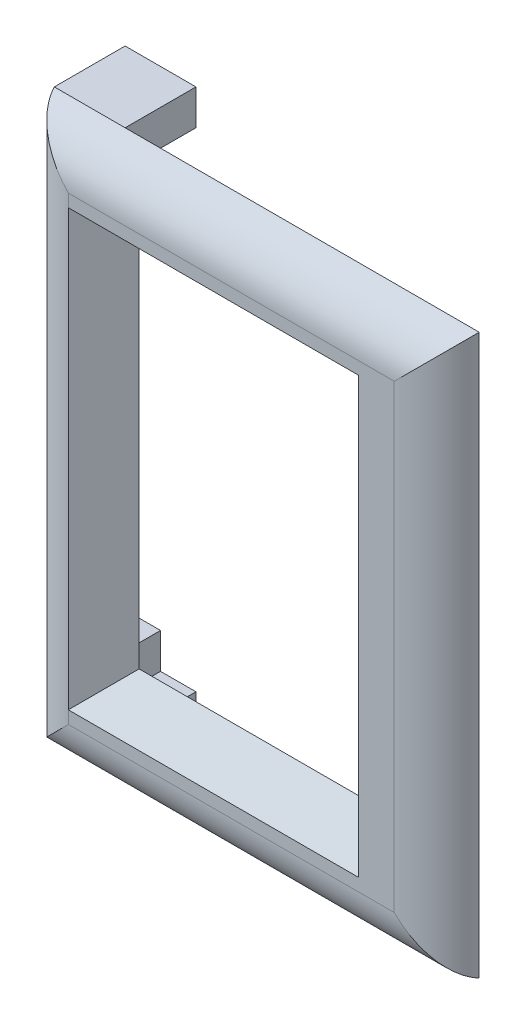
ISO-10303-21;
HEADER;
FILE_DESCRIPTION(('STEP AP214'),'2;1');
FILE_NAME('part.step','',(''),(''),'','','');
FILE_SCHEMA(('AUTOMOTIVE_DESIGN { 1 0 10303 214 1 1 1 1 }'));
ENDSEC;
DATA;
#1=APPLICATION_CONTEXT('core data for automotive mechanical design processes');
#2=APPLICATION_PROTOCOL_DEFINITION('international standard','automotive_design',2000,#1);
#3=PRODUCT_CONTEXT('',#1,'mechanical');
#4=PRODUCT('Part','Part','',(#3));
#5=PRODUCT_RELATED_PRODUCT_CATEGORY('part','',(#4));
#6=PRODUCT_DEFINITION_FORMATION('','',#4);
#7=PRODUCT_DEFINITION_CONTEXT('part definition',#1,'design');
#8=PRODUCT_DEFINITION('design','',#6,#7);
#9=PRODUCT_DEFINITION_SHAPE('','',#8);
#10=(LENGTH_UNIT() NAMED_UNIT(*) SI_UNIT(.MILLI.,.METRE.));
#11=(NAMED_UNIT(*) PLANE_ANGLE_UNIT() SI_UNIT($,.RADIAN.));
#12=(NAMED_UNIT(*) SI_UNIT($,.STERADIAN.) SOLID_ANGLE_UNIT());
#13=UNCERTAINTY_MEASURE_WITH_UNIT(LENGTH_MEASURE(1.E-05),#10,'distance_accuracy_value','');
#14=(GEOMETRIC_REPRESENTATION_CONTEXT(3) GLOBAL_UNCERTAINTY_ASSIGNED_CONTEXT((#13)) GLOBAL_UNIT_ASSIGNED_CONTEXT((#10,
#11,#12)) REPRESENTATION_CONTEXT('',''));
#15=CARTESIAN_POINT('',(0.,0.,0.));
#16=DIRECTION('',(0.,0.,1.));
#17=DIRECTION('',(1.,0.,0.));
#18=AXIS2_PLACEMENT_3D('',#15,#16,#17);
#19=CARTESIAN_POINT('',(0.,0.,2.5));
#20=DIRECTION('',(0.,0.,1.));
#21=DIRECTION('',(1.,0.,0.));
#22=AXIS2_PLACEMENT_3D('',#19,#20,#21);
#23=PLANE('',#22);
#24=DIRECTION('',(1.,0.,0.));
#25=VECTOR('',#24,1.);
#26=CARTESIAN_POINT('',(3.59725964294014E-08,16.2424852932564,2.5));
#27=LINE('',#26,#25);
#28=CARTESIAN_POINT('',(26.5000000359726,16.2424852932564,2.5));
#29=VERTEX_POINT('',#28);
#30=CARTESIAN_POINT('',(3.5000000359726,16.2424852932564,2.5));
#31=VERTEX_POINT('',#30);
#32=EDGE_CURVE('E313',#29,#31,#27,.F.);
#33=ORIENTED_EDGE('',*,*,#32,.T.);
#34=DIRECTION('',(0.,1.,0.));
#35=VECTOR('',#34,1.);
#36=CARTESIAN_POINT('',(3.5000000359726,-19.7427265614296,2.5));
#37=LINE('',#36,#35);
#38=CARTESIAN_POINT('',(3.5000000359726,15.3499974171089,2.5));
#39=VERTEX_POINT('',#38);
#40=EDGE_CURVE('E318',#31,#39,#37,.F.);
#41=ORIENTED_EDGE('',*,*,#40,.T.);
#42=DIRECTION('',(1.,0.,0.));
#43=VECTOR('',#42,1.);
#44=CARTESIAN_POINT('',(20.9876018688099,15.3499974171089,2.5));
#45=LINE('',#44,#43);
#46=CARTESIAN_POINT('',(23.98760186881,15.3499974171089,2.5));
#47=VERTEX_POINT('',#46);
#48=EDGE_CURVE('E292',#39,#47,#45,.T.);
#49=ORIENTED_EDGE('',*,*,#48,.T.);
#50=DIRECTION('',(0.,-1.,0.));
#51=VECTOR('',#50,1.);
#52=CARTESIAN_POINT('',(23.98760186881,-12.35000131526,2.5));
#53=LINE('',#52,#51);
#54=CARTESIAN_POINT('',(23.98760186881,-15.3500013152601,2.5));
#55=VERTEX_POINT('',#54);
#56=EDGE_CURVE('E294',#47,#55,#53,.T.);
#57=ORIENTED_EDGE('',*,*,#56,.T.);
#58=DIRECTION('',(-1.,0.,0.));
#59=VECTOR('',#58,1.);
#60=CARTESIAN_POINT('',(6.4875997094668,-15.3500013152601,2.5));
#61=LINE('',#60,#59);
#62=CARTESIAN_POINT('',(3.5000000359726,-15.3500013152601,2.5));
#63=VERTEX_POINT('',#62);
#64=EDGE_CURVE('E296',#55,#63,#61,.T.);
#65=ORIENTED_EDGE('',*,*,#64,.T.);
#66=DIRECTION('',(0.,1.,0.));
#67=VECTOR('',#66,1.);
#68=CARTESIAN_POINT('',(3.5000000359726,-19.7427265614296,2.5));
#69=LINE('',#68,#67);
#70=CARTESIAN_POINT('',(3.5000000359726,-16.2427265614296,2.5));
#71=VERTEX_POINT('',#70);
#72=EDGE_CURVE('E316',#63,#71,#69,.F.);
#73=ORIENTED_EDGE('',*,*,#72,.T.);
#74=DIRECTION('',(-1.,0.,0.));
#75=VECTOR('',#74,1.);
#76=CARTESIAN_POINT('',(30.0000000359726,-16.2427265614296,2.5));
#77=LINE('',#76,#75);
#78=CARTESIAN_POINT('',(26.5000000359726,-16.2427265614296,2.5));
#79=VERTEX_POINT('',#78);
#80=EDGE_CURVE('E311',#71,#79,#77,.F.);
#81=ORIENTED_EDGE('',*,*,#80,.T.);
#82=DIRECTION('',(0.,-1.,0.));
#83=VECTOR('',#82,1.);
#84=CARTESIAN_POINT('',(26.5000000359726,19.7424852932564,2.5));
#85=LINE('',#84,#83);
#86=EDGE_CURVE('E299',#79,#29,#85,.F.);
#87=ORIENTED_EDGE('',*,*,#86,.T.);
#88=EDGE_LOOP('',(#33,#41,#49,#57,#65,#73,#81,#87));
#89=FACE_BOUND('',#88,.T.);
#90=ADVANCED_FACE('F37',(#89),#23,.T.);
#91=CARTESIAN_POINT('',(0.,0.,0.));
#92=DIRECTION('',(0.,0.,1.));
#93=DIRECTION('',(1.,0.,0.));
#94=AXIS2_PLACEMENT_3D('',#91,#92,#93);
#95=PLANE('',#94);
#96=DIRECTION('',(0.,-1.,0.));
#97=VECTOR('',#96,1.);
#98=CARTESIAN_POINT('',(5.98759970946675,12.3499974171089,0.));
#99=LINE('',#98,#97);
#100=CARTESIAN_POINT('',(5.98759970946675,12.8499974171089,0.));
#101=VERTEX_POINT('',#100);
#102=CARTESIAN_POINT('',(5.98759970946675,-12.8500013152601,0.));
#103=VERTEX_POINT('',#102);
#104=EDGE_CURVE('E283',#101,#103,#99,.T.);
#105=ORIENTED_EDGE('',*,*,#104,.T.);
#106=DIRECTION('',(1.,0.,0.));
#107=VECTOR('',#106,1.);
#108=CARTESIAN_POINT('',(6.4875997094668,-12.8500013152601,0.));
#109=LINE('',#108,#107);
#110=CARTESIAN_POINT('',(21.48760186881,-12.8500013152601,0.));
#111=VERTEX_POINT('',#110);
#112=EDGE_CURVE('E289',#103,#111,#109,.T.);
#113=ORIENTED_EDGE('',*,*,#112,.T.);
#114=DIRECTION('',(0.,1.,0.));
#115=VECTOR('',#114,1.);
#116=CARTESIAN_POINT('',(21.48760186881,12.3499974171089,0.));
#117=LINE('',#116,#115);
#118=CARTESIAN_POINT('',(21.48760186881,12.8499974171089,0.));
#119=VERTEX_POINT('',#118);
#120=EDGE_CURVE('E287',#111,#119,#117,.T.);
#121=ORIENTED_EDGE('',*,*,#120,.T.);
#122=DIRECTION('',(-1.,0.,0.));
#123=VECTOR('',#122,1.);
#124=CARTESIAN_POINT('',(6.4875997094668,12.8499974171089,0.));
#125=LINE('',#124,#123);
#126=EDGE_CURVE('E285',#119,#101,#125,.T.);
#127=ORIENTED_EDGE('',*,*,#126,.T.);
#128=EDGE_LOOP('',(#105,#113,#121,#127));
#129=FACE_BOUND('',#128,.T.);
#130=DIRECTION('',(1.,0.,0.));
#131=VECTOR('',#130,1.);
#132=CARTESIAN_POINT('',(3.59726012642655E-08,-19.7427265614296,0.));
#133=LINE('',#132,#131);
#134=CARTESIAN_POINT('',(5.0000000359726,-19.7427265614296,0.));
#135=VERTEX_POINT('',#134);
#136=CARTESIAN_POINT('',(30.0000000359726,-19.7427265614296,0.));
#137=VERTEX_POINT('',#136);
#138=EDGE_CURVE('E279',#135,#137,#133,.T.);
#139=ORIENTED_EDGE('',*,*,#138,.F.);
#140=DIRECTION('',(0.,1.,0.));
#141=VECTOR('',#140,1.);
#142=CARTESIAN_POINT('',(5.0000000359726,0.,0.));
#143=LINE('',#142,#141);
#144=CARTESIAN_POINT('',(5.0000000359726,-17.2427265614296,0.));
#145=VERTEX_POINT('',#144);
#146=EDGE_CURVE('E214',#135,#145,#143,.T.);
#147=ORIENTED_EDGE('',*,*,#146,.T.);
#148=DIRECTION('',(1.,0.,0.));
#149=VECTOR('',#148,1.);
#150=CARTESIAN_POINT('',(0.,-17.2427265614296,0.));
#151=LINE('',#150,#149);
#152=CARTESIAN_POINT('',(2.5,-17.2427265614296,0.));
#153=VERTEX_POINT('',#152);
#154=EDGE_CURVE('E212',#153,#145,#151,.T.);
#155=ORIENTED_EDGE('',*,*,#154,.F.);
#156=DIRECTION('',(0.,1.,0.));
#157=VECTOR('',#156,1.);
#158=CARTESIAN_POINT('',(2.5,0.,0.));
#159=LINE('',#158,#157);
#160=CARTESIAN_POINT('',(2.5,-14.7427265614296,0.));
#161=VERTEX_POINT('',#160);
#162=EDGE_CURVE('E180',#153,#161,#159,.T.);
#163=ORIENTED_EDGE('',*,*,#162,.T.);
#164=DIRECTION('',(1.,0.,0.));
#165=VECTOR('',#164,1.);
#166=CARTESIAN_POINT('',(0.,-14.7427265614296,0.));
#167=LINE('',#166,#165);
#168=CARTESIAN_POINT('',(3.59726006520281E-08,-14.7427265614296,0.));
#169=VERTEX_POINT('',#168);
#170=EDGE_CURVE('E198',#169,#161,#167,.T.);
#171=ORIENTED_EDGE('',*,*,#170,.F.);
#172=DIRECTION('',(0.,-1.,0.));
#173=VECTOR('',#172,1.);
#174=CARTESIAN_POINT('',(3.59725964294014E-08,19.7424852932564,0.));
#175=LINE('',#174,#173);
#176=CARTESIAN_POINT('',(3.59725970416099E-08,14.7427205891547,0.));
#177=VERTEX_POINT('',#176);
#178=EDGE_CURVE('E275',#177,#169,#175,.T.);
#179=ORIENTED_EDGE('',*,*,#178,.F.);
#180=DIRECTION('',(0.999999999999985,1.74845464495643E-07,0.));
#181=VECTOR('',#180,1.);
#182=CARTESIAN_POINT('',(-2.57769777201977E-06,14.7427202613195,0.));
#183=LINE('',#182,#181);
#184=CARTESIAN_POINT('',(2.49999742230164,14.7427206984331,0.));
#185=VERTEX_POINT('',#184);
#186=EDGE_CURVE('E54',#177,#185,#183,.T.);
#187=ORIENTED_EDGE('',*,*,#186,.T.);
#188=DIRECTION('',(1.70528752230226E-07,-0.999999999999986,0.));
#189=VECTOR('',#188,1.);
#190=CARTESIAN_POINT('',(2.49999993635933,4.26321869723007E-07,0.));
#191=LINE('',#190,#189);
#192=CARTESIAN_POINT('',(2.49999699597976,17.2427206984331,0.));
#193=VERTEX_POINT('',#192);
#194=EDGE_CURVE('E59',#193,#185,#191,.T.);
#195=ORIENTED_EDGE('',*,*,#194,.F.);
#196=DIRECTION('',(0.999999999999985,1.74845464122321E-07,0.));
#197=VECTOR('',#196,1.);
#198=CARTESIAN_POINT('',(-3.01481142682179E-06,17.2427202613194,0.));
#199=LINE('',#198,#197);
#200=CARTESIAN_POINT('',(4.99999702116054,17.2427211355468,0.));
#201=VERTEX_POINT('',#200);
#202=EDGE_CURVE('E249',#193,#201,#199,.T.);
#203=ORIENTED_EDGE('',*,*,#202,.T.);
#204=DIRECTION('',(1.74845464842588E-07,-0.999999999999985,0.));
#205=VECTOR('',#204,1.);
#206=CARTESIAN_POINT('',(5.00000003597198,8.74227330502489E-07,0.));
#207=LINE('',#206,#205);
#208=CARTESIAN_POINT('',(4.99999691188212,19.7424852932564,0.));
#209=VERTEX_POINT('',#208);
#210=EDGE_CURVE('E246',#209,#201,#207,.T.);
#211=ORIENTED_EDGE('',*,*,#210,.F.);
#212=DIRECTION('',(-1.,0.,0.));
#213=VECTOR('',#212,1.);
#214=CARTESIAN_POINT('',(3.59725964294014E-08,19.7424852932564,0.));
#215=LINE('',#214,#213);
#216=CARTESIAN_POINT('',(30.0000000359726,19.7424852932564,0.));
#217=VERTEX_POINT('',#216);
#218=EDGE_CURVE('E271',#217,#209,#215,.T.);
#219=ORIENTED_EDGE('',*,*,#218,.F.);
#220=DIRECTION('',(0.,1.,0.));
#221=VECTOR('',#220,1.);
#222=CARTESIAN_POINT('',(30.0000000359726,19.7424852932564,0.));
#223=LINE('',#222,#221);
#224=EDGE_CURVE('E268',#137,#217,#223,.T.);
#225=ORIENTED_EDGE('',*,*,#224,.F.);
#226=EDGE_LOOP('',(#139,#147,#155,#163,#171,#179,#187,#195,#203,#211,#219,#225));
#227=FACE_BOUND('',#226,.T.);
#228=ADVANCED_FACE('F343',(#129,#227),#95,.F.);
#229=CARTESIAN_POINT('',(6.4875997094668,12.3499974171089,-0.500000000000053));
#230=DIRECTION('',(0.,-0.707106781186551,0.707106781186544));
#231=DIRECTION('',(1.,0.,0.));
#232=AXIS2_PLACEMENT_3D('',#229,#230,#231);
#233=PLANE('',#232);
#234=ORIENTED_EDGE('',*,*,#48,.F.);
#235=CARTESIAN_POINT('',(3.5000000359726,11.649997417109,-1.2));
#236=DIRECTION('',(0.,-0.707106781186551,0.707106781186544));
#237=DIRECTION('',(0.,-0.707106781186544,-0.707106781186551));
#238=AXIS2_PLACEMENT_3D('',#235,#236,#237);
#239=ELLIPSE('',#238,5.23259018078043,3.7);
#240=CARTESIAN_POINT('',(3.48762041964641,15.3499767069293,2.49997928982037));
#241=VERTEX_POINT('',#240);
#242=EDGE_CURVE('E320',#39,#241,#239,.T.);
#243=ORIENTED_EDGE('',*,*,#242,.T.);
#244=DIRECTION('',(0.577350269189624,-0.577350269189624,-0.57735026918963));
#245=VECTOR('',#244,1.);
#246=CARTESIAN_POINT('',(6.4875997094668,12.3499974171089,-0.500000000000053));
#247=LINE('',#246,#245);
#248=EDGE_CURVE('E272',#101,#241,#247,.F.);
#249=ORIENTED_EDGE('',*,*,#248,.F.);
#250=ORIENTED_EDGE('',*,*,#126,.F.);
#251=DIRECTION('',(-0.577350269189624,-0.577350269189624,-0.57735026918963));
#252=VECTOR('',#251,1.);
#253=CARTESIAN_POINT('',(16.1542678156956,7.51666336399455,-5.33333405311445));
#254=LINE('',#253,#252);
#255=EDGE_CURVE('E305',#47,#119,#254,.T.);
#256=ORIENTED_EDGE('',*,*,#255,.F.);
#257=EDGE_LOOP('',(#234,#243,#249,#250,#256));
#258=FACE_BOUND('',#257,.T.);
#259=ADVANCED_FACE('F385',(#258),#233,.T.);
#260=CARTESIAN_POINT('',(6.4875997094668,12.3499974171089,-0.500000000000053));
#261=DIRECTION('',(0.707106781186551,0.,0.707106781186544));
#262=DIRECTION('',(0.,1.,0.));
#263=AXIS2_PLACEMENT_3D('',#260,#261,#262);
#264=PLANE('',#263);
#265=ORIENTED_EDGE('',*,*,#248,.T.);
#266=DIRECTION('',(0.,-1.,0.));
#267=VECTOR('',#266,1.);
#268=CARTESIAN_POINT('',(3.48762041964641,15.3499767069293,2.49997928982037));
#269=LINE('',#268,#267);
#270=CARTESIAN_POINT('',(3.48762041964642,-15.3499806050804,2.49997928982036));
#271=VERTEX_POINT('',#270);
#272=EDGE_CURVE('E46',#241,#271,#269,.T.);
#273=ORIENTED_EDGE('',*,*,#272,.T.);
#274=DIRECTION('',(-0.577350269189624,-0.577350269189624,0.57735026918963));
#275=VECTOR('',#274,1.);
#276=CARTESIAN_POINT('',(14.7209326202564,-4.11666840447045,-8.73333291078973));
#277=LINE('',#276,#275);
#278=EDGE_CURVE('E302',#103,#271,#277,.T.);
#279=ORIENTED_EDGE('',*,*,#278,.F.);
#280=ORIENTED_EDGE('',*,*,#104,.F.);
#281=EDGE_LOOP('',(#265,#273,#279,#280));
#282=FACE_BOUND('',#281,.T.);
#283=ADVANCED_FACE('F381',(#282),#264,.T.);
#284=CARTESIAN_POINT('',(20.9876018688099,12.3499974171089,-0.500000000000053));
#285=DIRECTION('',(-0.707106781186551,0.,0.707106781186544));
#286=DIRECTION('',(0.,-1.,0.));
#287=AXIS2_PLACEMENT_3D('',#284,#285,#286);
#288=PLANE('',#287);
#289=ORIENTED_EDGE('',*,*,#255,.T.);
#290=ORIENTED_EDGE('',*,*,#120,.F.);
#291=DIRECTION('',(-0.577350269189624,0.577350269189624,-0.57735026918963));
#292=VECTOR('',#291,1.);
#293=CARTESIAN_POINT('',(12.7542689580204,-4.11666840447045,-8.73333291078973));
#294=LINE('',#293,#292);
#295=EDGE_CURVE('E300',#55,#111,#294,.T.);
#296=ORIENTED_EDGE('',*,*,#295,.F.);
#297=ORIENTED_EDGE('',*,*,#56,.F.);
#298=EDGE_LOOP('',(#289,#290,#296,#297));
#299=FACE_BOUND('',#298,.T.);
#300=ADVANCED_FACE('F389',(#299),#288,.T.);
#301=CARTESIAN_POINT('',(6.4875997094668,-12.35000131526,-0.500000000000053));
#302=DIRECTION('',(0.,0.707106781186551,0.707106781186544));
#303=DIRECTION('',(-1.,0.,0.));
#304=AXIS2_PLACEMENT_3D('',#301,#302,#303);
#305=PLANE('',#304);
#306=ORIENTED_EDGE('',*,*,#278,.T.);
#307=CARTESIAN_POINT('',(3.5000000359726,-11.6500013152601,-1.2));
#308=DIRECTION('',(0.,0.707106781186551,0.707106781186544));
#309=DIRECTION('',(0.,-0.707106781186544,0.707106781186551));
#310=AXIS2_PLACEMENT_3D('',#307,#308,#309);
#311=ELLIPSE('',#310,5.23259018078043,3.7);
#312=EDGE_CURVE('E11',#271,#63,#311,.T.);
#313=ORIENTED_EDGE('',*,*,#312,.T.);
#314=ORIENTED_EDGE('',*,*,#64,.F.);
#315=ORIENTED_EDGE('',*,*,#295,.T.);
#316=ORIENTED_EDGE('',*,*,#112,.F.);
#317=EDGE_LOOP('',(#306,#313,#314,#315,#316));
#318=FACE_BOUND('',#317,.T.);
#319=ADVANCED_FACE('F375',(#318),#305,.T.);
#320=CARTESIAN_POINT('',(3.59726012642655E-08,-16.2427265614296,-1.2));
#321=DIRECTION('',(1.,0.,0.));
#322=DIRECTION('',(0.,0.,-1.));
#323=AXIS2_PLACEMENT_3D('',#320,#321,#322);
#324=CYLINDRICAL_SURFACE('',#323,3.7);
#325=CARTESIAN_POINT('',(3.5000000359726,-16.2427265614296,-1.2));
#326=DIRECTION('',(0.707106781186548,-0.707106781186547,0.));
#327=DIRECTION('',(-0.707106781186547,-0.707106781186548,0.));
#328=AXIS2_PLACEMENT_3D('',#325,#326,#327);
#329=ELLIPSE('',#328,5.23259018078045,3.7);
#330=CARTESIAN_POINT('',(3.59726012642655E-08,-19.7427265614296,0.));
#331=VERTEX_POINT('',#330);
#332=EDGE_CURVE('E325',#331,#71,#329,.F.);
#333=ORIENTED_EDGE('',*,*,#332,.F.);
#334=EDGE_CURVE('E280',#331,#135,#133,.T.);
#335=ORIENTED_EDGE('',*,*,#334,.T.);
#336=ORIENTED_EDGE('',*,*,#138,.T.);
#337=CARTESIAN_POINT('',(26.5000000359726,-16.2427265614296,-1.2));
#338=DIRECTION('',(0.707106781186547,0.707106781186547,0.));
#339=DIRECTION('',(-0.707106781186547,0.707106781186547,0.));
#340=AXIS2_PLACEMENT_3D('',#337,#338,#339);
#341=ELLIPSE('',#340,5.23259018078045,3.7);
#342=EDGE_CURVE('E41',#79,#137,#341,.T.);
#343=ORIENTED_EDGE('',*,*,#342,.F.);
#344=ORIENTED_EDGE('',*,*,#80,.F.);
#345=EDGE_LOOP('',(#333,#335,#336,#343,#344));
#346=FACE_BOUND('',#345,.T.);
#347=ADVANCED_FACE('F39',(#346),#324,.T.);
#348=CARTESIAN_POINT('',(26.5000000359726,19.7424852932564,-1.2));
#349=DIRECTION('',(0.,1.,0.));
#350=DIRECTION('',(0.,0.,1.));
#351=AXIS2_PLACEMENT_3D('',#348,#349,#350);
#352=CYLINDRICAL_SURFACE('',#351,3.7);
#353=ORIENTED_EDGE('',*,*,#342,.T.);
#354=ORIENTED_EDGE('',*,*,#224,.T.);
#355=CARTESIAN_POINT('',(26.5000000359726,16.2424852932564,-1.2));
#356=DIRECTION('',(-0.707106781186547,0.707106781186547,0.));
#357=DIRECTION('',(0.707106781186547,0.707106781186547,0.));
#358=AXIS2_PLACEMENT_3D('',#355,#356,#357);
#359=ELLIPSE('',#358,5.23259018078045,3.7);
#360=EDGE_CURVE('E324',#29,#217,#359,.T.);
#361=ORIENTED_EDGE('',*,*,#360,.F.);
#362=ORIENTED_EDGE('',*,*,#86,.F.);
#363=EDGE_LOOP('',(#353,#354,#361,#362));
#364=FACE_BOUND('',#363,.T.);
#365=ADVANCED_FACE('F335',(#364),#352,.T.);
#366=CARTESIAN_POINT('',(3.5000000359726,19.7424852932564,-1.2));
#367=DIRECTION('',(0.,-1.,0.));
#368=DIRECTION('',(1.,0.,0.));
#369=AXIS2_PLACEMENT_3D('',#366,#367,#368);
#370=CYLINDRICAL_SURFACE('',#369,3.7);
#371=ORIENTED_EDGE('',*,*,#242,.F.);
#372=ORIENTED_EDGE('',*,*,#40,.F.);
#373=CARTESIAN_POINT('',(3.5000000359726,16.2424852932564,-1.2));
#374=DIRECTION('',(-0.707106781186547,-0.707106781186548,0.));
#375=DIRECTION('',(0.707106781186548,-0.707106781186547,0.));
#376=AXIS2_PLACEMENT_3D('',#373,#374,#375);
#377=ELLIPSE('',#376,5.23259018078045,3.7);
#378=CARTESIAN_POINT('',(3.59725964294014E-08,19.7424852932564,0.));
#379=VERTEX_POINT('',#378);
#380=EDGE_CURVE('E267',#379,#31,#377,.F.);
#381=ORIENTED_EDGE('',*,*,#380,.F.);
#382=EDGE_CURVE('E276',#379,#177,#175,.T.);
#383=ORIENTED_EDGE('',*,*,#382,.T.);
#384=ORIENTED_EDGE('',*,*,#178,.T.);
#385=DIRECTION('',(0.,1.,0.));
#386=VECTOR('',#385,1.);
#387=CARTESIAN_POINT('',(3.59725988468187E-08,0.,0.));
#388=LINE('',#387,#386);
#389=EDGE_CURVE('E201',#331,#169,#388,.T.);
#390=ORIENTED_EDGE('',*,*,#389,.F.);
#391=ORIENTED_EDGE('',*,*,#332,.T.);
#392=ORIENTED_EDGE('',*,*,#72,.F.);
#393=ORIENTED_EDGE('',*,*,#312,.F.);
#394=ORIENTED_EDGE('',*,*,#272,.F.);
#395=EDGE_LOOP('',(#371,#372,#381,#383,#384,#390,#391,#392,#393,#394));
#396=FACE_BOUND('',#395,.T.);
#397=ADVANCED_FACE('F367',(#396),#370,.T.);
#398=CARTESIAN_POINT('',(3.59725964294014E-08,16.2424852932564,-1.2));
#399=DIRECTION('',(-1.,0.,0.));
#400=DIRECTION('',(0.,0.,1.));
#401=AXIS2_PLACEMENT_3D('',#398,#399,#400);
#402=CYLINDRICAL_SURFACE('',#401,3.7);
#403=ORIENTED_EDGE('',*,*,#360,.T.);
#404=ORIENTED_EDGE('',*,*,#218,.T.);
#405=DIRECTION('',(1.,0.,0.));
#406=VECTOR('',#405,1.);
#407=CARTESIAN_POINT('',(0.,19.7424852932564,0.));
#408=LINE('',#407,#406);
#409=EDGE_CURVE('E243',#379,#209,#408,.T.);
#410=ORIENTED_EDGE('',*,*,#409,.F.);
#411=ORIENTED_EDGE('',*,*,#380,.T.);
#412=ORIENTED_EDGE('',*,*,#32,.F.);
#413=EDGE_LOOP('',(#403,#404,#410,#411,#412));
#414=FACE_BOUND('',#413,.T.);
#415=ADVANCED_FACE('F345',(#414),#402,.T.);
#416=CARTESIAN_POINT('',(-2.57769777201977E-06,14.7427202613195,-5.));
#417=DIRECTION('',(1.74845464495643E-07,-0.999999999999985,0.));
#418=DIRECTION('',(0.999999999999985,1.74845464495643E-07,0.));
#419=AXIS2_PLACEMENT_3D('',#416,#417,#418);
#420=PLANE('',#419);
#421=ORIENTED_EDGE('',*,*,#186,.F.);
#422=DIRECTION('',(0.,0.,1.));
#423=VECTOR('',#422,1.);
#424=CARTESIAN_POINT('',(3.59725970416099E-08,14.7427204798763,-5.));
#425=LINE('',#424,#423);
#426=CARTESIAN_POINT('',(3.59725970416099E-08,14.7427204798763,-5.));
#427=VERTEX_POINT('',#426);
#428=EDGE_CURVE('E264',#427,#177,#425,.T.);
#429=ORIENTED_EDGE('',*,*,#428,.F.);
#430=DIRECTION('',(0.999999999999985,1.74845464495643E-07,0.));
#431=VECTOR('',#430,1.);
#432=CARTESIAN_POINT('',(-2.57769777201977E-06,14.7427202613195,-5.));
#433=LINE('',#432,#431);
#434=CARTESIAN_POINT('',(2.49999742230164,14.7427206984331,-5.));
#435=VERTEX_POINT('',#434);
#436=EDGE_CURVE('E227',#427,#435,#433,.T.);
#437=ORIENTED_EDGE('',*,*,#436,.T.);
#438=DIRECTION('',(0.,0.,1.));
#439=VECTOR('',#438,1.);
#440=CARTESIAN_POINT('',(2.49999742230164,14.7427206984331,-5.));
#441=LINE('',#440,#439);
#442=EDGE_CURVE('E241',#435,#185,#441,.T.);
#443=ORIENTED_EDGE('',*,*,#442,.T.);
#444=EDGE_LOOP('',(#421,#429,#437,#443));
#445=FACE_BOUND('',#444,.T.);
#446=ADVANCED_FACE('F422',(#445),#420,.T.);
#447=CARTESIAN_POINT('',(3.59725988468187E-08,0.,-5.));
#448=DIRECTION('',(1.,0.,0.));
#449=DIRECTION('',(0.,1.,0.));
#450=AXIS2_PLACEMENT_3D('',#447,#448,#449);
#451=PLANE('',#450);
#452=ORIENTED_EDGE('',*,*,#382,.F.);
#453=DIRECTION('',(0.,0.,1.));
#454=VECTOR('',#453,1.);
#455=CARTESIAN_POINT('',(3.59725964294011E-08,19.7424852932564,-5.));
#456=LINE('',#455,#454);
#457=CARTESIAN_POINT('',(3.59725964294011E-08,19.7424852932564,-5.));
#458=VERTEX_POINT('',#457);
#459=EDGE_CURVE('E261',#458,#379,#456,.T.);
#460=ORIENTED_EDGE('',*,*,#459,.F.);
#461=DIRECTION('',(0.,1.,0.));
#462=VECTOR('',#461,1.);
#463=CARTESIAN_POINT('',(3.59725988468187E-08,0.,-5.));
#464=LINE('',#463,#462);
#465=EDGE_CURVE('E230',#427,#458,#464,.T.);
#466=ORIENTED_EDGE('',*,*,#465,.F.);
#467=ORIENTED_EDGE('',*,*,#428,.T.);
#468=EDGE_LOOP('',(#452,#460,#466,#467));
#469=FACE_BOUND('',#468,.T.);
#470=ADVANCED_FACE('F364',(#469),#451,.F.);
#471=CARTESIAN_POINT('',(0.,19.7424852932564,-5.));
#472=DIRECTION('',(0.,-1.,0.));
#473=DIRECTION('',(0.,0.,-1.));
#474=AXIS2_PLACEMENT_3D('',#471,#472,#473);
#475=PLANE('',#474);
#476=ORIENTED_EDGE('',*,*,#409,.T.);
#477=DIRECTION('',(0.,0.,1.));
#478=VECTOR('',#477,1.);
#479=CARTESIAN_POINT('',(4.99999680260371,19.7424852932564,-5.));
#480=LINE('',#479,#478);
#481=CARTESIAN_POINT('',(4.99999680260371,19.7424852932564,-5.));
#482=VERTEX_POINT('',#481);
#483=EDGE_CURVE('E258',#482,#209,#480,.T.);
#484=ORIENTED_EDGE('',*,*,#483,.F.);
#485=DIRECTION('',(1.,0.,0.));
#486=VECTOR('',#485,1.);
#487=CARTESIAN_POINT('',(0.,19.7424852932564,-5.));
#488=LINE('',#487,#486);
#489=EDGE_CURVE('E232',#458,#482,#488,.T.);
#490=ORIENTED_EDGE('',*,*,#489,.F.);
#491=ORIENTED_EDGE('',*,*,#459,.T.);
#492=EDGE_LOOP('',(#476,#484,#490,#491));
#493=FACE_BOUND('',#492,.T.);
#494=ADVANCED_FACE('F350',(#493),#475,.F.);
#495=CARTESIAN_POINT('',(5.00000003597198,8.74227330502489E-07,-5.));
#496=DIRECTION('',(-0.999999999999985,-1.74845464842588E-07,0.));
#497=DIRECTION('',(1.74845464842588E-07,-0.999999999999985,0.));
#498=AXIS2_PLACEMENT_3D('',#495,#496,#497);
#499=PLANE('',#498);
#500=ORIENTED_EDGE('',*,*,#210,.T.);
#501=DIRECTION('',(0.,0.,1.));
#502=VECTOR('',#501,1.);
#503=CARTESIAN_POINT('',(4.99999702116054,17.2427211355468,-5.));
#504=LINE('',#503,#502);
#505=CARTESIAN_POINT('',(4.99999702116054,17.2427211355468,-5.));
#506=VERTEX_POINT('',#505);
#507=EDGE_CURVE('E255',#506,#201,#504,.T.);
#508=ORIENTED_EDGE('',*,*,#507,.F.);
#509=DIRECTION('',(1.74845464842588E-07,-0.999999999999985,0.));
#510=VECTOR('',#509,1.);
#511=CARTESIAN_POINT('',(5.00000003597198,8.74227330502489E-07,-5.));
#512=LINE('',#511,#510);
#513=EDGE_CURVE('E234',#482,#506,#512,.T.);
#514=ORIENTED_EDGE('',*,*,#513,.F.);
#515=ORIENTED_EDGE('',*,*,#483,.T.);
#516=EDGE_LOOP('',(#500,#508,#514,#515));
#517=FACE_BOUND('',#516,.T.);
#518=ADVANCED_FACE('F355',(#517),#499,.F.);
#519=CARTESIAN_POINT('',(-3.01481142682179E-06,17.2427202613194,-5.));
#520=DIRECTION('',(1.74845464122321E-07,-0.999999999999985,0.));
#521=DIRECTION('',(0.999999999999985,1.74845464122321E-07,0.));
#522=AXIS2_PLACEMENT_3D('',#519,#520,#521);
#523=PLANE('',#522);
#524=ORIENTED_EDGE('',*,*,#202,.F.);
#525=DIRECTION('',(0.,0.,1.));
#526=VECTOR('',#525,1.);
#527=CARTESIAN_POINT('',(2.49999699597976,17.2427206984331,-5.));
#528=LINE('',#527,#526);
#529=CARTESIAN_POINT('',(2.49999699597976,17.2427206984331,-5.));
#530=VERTEX_POINT('',#529);
#531=EDGE_CURVE('E253',#530,#193,#528,.T.);
#532=ORIENTED_EDGE('',*,*,#531,.F.);
#533=DIRECTION('',(0.999999999999985,1.74845464122321E-07,0.));
#534=VECTOR('',#533,1.);
#535=CARTESIAN_POINT('',(-3.01481142682179E-06,17.2427202613194,-5.));
#536=LINE('',#535,#534);
#537=EDGE_CURVE('E236',#530,#506,#536,.T.);
#538=ORIENTED_EDGE('',*,*,#537,.T.);
#539=ORIENTED_EDGE('',*,*,#507,.T.);
#540=EDGE_LOOP('',(#524,#532,#538,#539));
#541=FACE_BOUND('',#540,.T.);
#542=ADVANCED_FACE('F506',(#541),#523,.T.);
#543=CARTESIAN_POINT('',(2.49999993635933,4.26321869723007E-07,-5.));
#544=DIRECTION('',(-0.999999999999985,-1.70528752230226E-07,0.));
#545=DIRECTION('',(1.70528752230226E-07,-0.999999999999985,0.));
#546=AXIS2_PLACEMENT_3D('',#543,#544,#545);
#547=PLANE('',#546);
#548=ORIENTED_EDGE('',*,*,#194,.T.);
#549=ORIENTED_EDGE('',*,*,#442,.F.);
#550=DIRECTION('',(1.70528752230226E-07,-0.999999999999986,0.));
#551=VECTOR('',#550,1.);
#552=CARTESIAN_POINT('',(2.49999993635933,4.26321869723007E-07,-5.));
#553=LINE('',#552,#551);
#554=EDGE_CURVE('E239',#530,#435,#553,.T.);
#555=ORIENTED_EDGE('',*,*,#554,.F.);
#556=ORIENTED_EDGE('',*,*,#531,.T.);
#557=EDGE_LOOP('',(#548,#549,#555,#556));
#558=FACE_BOUND('',#557,.T.);
#559=ADVANCED_FACE('F514',(#558),#547,.F.);
#560=CARTESIAN_POINT('',(0.,0.,-5.));
#561=DIRECTION('',(0.,0.,-1.));
#562=DIRECTION('',(-1.,0.,0.));
#563=AXIS2_PLACEMENT_3D('',#560,#561,#562);
#564=PLANE('',#563);
#565=ORIENTED_EDGE('',*,*,#436,.F.);
#566=ORIENTED_EDGE('',*,*,#465,.T.);
#567=ORIENTED_EDGE('',*,*,#489,.T.);
#568=ORIENTED_EDGE('',*,*,#513,.T.);
#569=ORIENTED_EDGE('',*,*,#537,.F.);
#570=ORIENTED_EDGE('',*,*,#554,.T.);
#571=EDGE_LOOP('',(#565,#566,#567,#568,#569,#570));
#572=FACE_BOUND('',#571,.T.);
#573=ADVANCED_FACE('F360',(#572),#564,.T.);
#574=CARTESIAN_POINT('',(2.5,0.,-5.));
#575=DIRECTION('',(1.,0.,0.));
#576=DIRECTION('',(0.,0.,-1.));
#577=AXIS2_PLACEMENT_3D('',#574,#575,#576);
#578=PLANE('',#577);
#579=ORIENTED_EDGE('',*,*,#162,.F.);
#580=DIRECTION('',(0.,0.,1.));
#581=VECTOR('',#580,1.);
#582=CARTESIAN_POINT('',(2.5,-17.2427265614296,-5.));
#583=LINE('',#582,#581);
#584=CARTESIAN_POINT('',(2.5,-17.2427265614296,-5.));
#585=VERTEX_POINT('',#584);
#586=EDGE_CURVE('E174',#585,#153,#583,.T.);
#587=ORIENTED_EDGE('',*,*,#586,.F.);
#588=DIRECTION('',(0.,1.,0.));
#589=VECTOR('',#588,1.);
#590=CARTESIAN_POINT('',(2.5,0.,-5.));
#591=LINE('',#590,#589);
#592=CARTESIAN_POINT('',(2.5,-14.7427265614296,-5.));
#593=VERTEX_POINT('',#592);
#594=EDGE_CURVE('E178',#585,#593,#591,.T.);
#595=ORIENTED_EDGE('',*,*,#594,.T.);
#596=DIRECTION('',(0.,0.,1.));
#597=VECTOR('',#596,1.);
#598=CARTESIAN_POINT('',(2.5,-14.7427265614296,-5.));
#599=LINE('',#598,#597);
#600=EDGE_CURVE('E210',#593,#161,#599,.T.);
#601=ORIENTED_EDGE('',*,*,#600,.T.);
#602=EDGE_LOOP('',(#579,#587,#595,#601));
#603=FACE_BOUND('',#602,.T.);
#604=ADVANCED_FACE('F176',(#603),#578,.T.);
#605=CARTESIAN_POINT('',(0.,-17.2427265614296,-5.));
#606=DIRECTION('',(0.,-1.,0.));
#607=DIRECTION('',(0.,0.,-1.));
#608=AXIS2_PLACEMENT_3D('',#605,#606,#607);
#609=PLANE('',#608);
#610=ORIENTED_EDGE('',*,*,#154,.T.);
#611=DIRECTION('',(0.,0.,1.));
#612=VECTOR('',#611,1.);
#613=CARTESIAN_POINT('',(5.0000000359726,-17.2427265614296,-5.));
#614=LINE('',#613,#612);
#615=CARTESIAN_POINT('',(5.0000000359726,-17.2427265614296,-5.));
#616=VERTEX_POINT('',#615);
#617=EDGE_CURVE('E184',#616,#145,#614,.T.);
#618=ORIENTED_EDGE('',*,*,#617,.F.);
#619=DIRECTION('',(1.,0.,0.));
#620=VECTOR('',#619,1.);
#621=CARTESIAN_POINT('',(0.,-17.2427265614296,-5.));
#622=LINE('',#621,#620);
#623=EDGE_CURVE('E187',#585,#616,#622,.T.);
#624=ORIENTED_EDGE('',*,*,#623,.F.);
#625=ORIENTED_EDGE('',*,*,#586,.T.);
#626=EDGE_LOOP('',(#610,#618,#624,#625));
#627=FACE_BOUND('',#626,.T.);
#628=ADVANCED_FACE('F188',(#627),#609,.F.);
#629=CARTESIAN_POINT('',(5.0000000359726,0.,-5.));
#630=DIRECTION('',(1.,0.,0.));
#631=DIRECTION('',(0.,0.,-1.));
#632=AXIS2_PLACEMENT_3D('',#629,#630,#631);
#633=PLANE('',#632);
#634=ORIENTED_EDGE('',*,*,#146,.F.);
#635=DIRECTION('',(0.,0.,1.));
#636=VECTOR('',#635,1.);
#637=CARTESIAN_POINT('',(5.0000000359726,-19.7427265614296,-5.));
#638=LINE('',#637,#636);
#639=CARTESIAN_POINT('',(5.0000000359726,-19.7427265614296,-5.));
#640=VERTEX_POINT('',#639);
#641=EDGE_CURVE('E224',#640,#135,#638,.T.);
#642=ORIENTED_EDGE('',*,*,#641,.F.);
#643=DIRECTION('',(0.,1.,0.));
#644=VECTOR('',#643,1.);
#645=CARTESIAN_POINT('',(5.0000000359726,0.,-5.));
#646=LINE('',#645,#644);
#647=EDGE_CURVE('E192',#640,#616,#646,.T.);
#648=ORIENTED_EDGE('',*,*,#647,.T.);
#649=ORIENTED_EDGE('',*,*,#617,.T.);
#650=EDGE_LOOP('',(#634,#642,#648,#649));
#651=FACE_BOUND('',#650,.T.);
#652=ADVANCED_FACE('F545',(#651),#633,.T.);
#653=CARTESIAN_POINT('',(0.,-19.7427265614296,-5.));
#654=DIRECTION('',(0.,1.,0.));
#655=DIRECTION('',(0.,0.,1.));
#656=AXIS2_PLACEMENT_3D('',#653,#654,#655);
#657=PLANE('',#656);
#658=ORIENTED_EDGE('',*,*,#334,.F.);
#659=DIRECTION('',(0.,0.,1.));
#660=VECTOR('',#659,1.);
#661=CARTESIAN_POINT('',(3.59726012642655E-08,-19.7427265614296,-5.));
#662=LINE('',#661,#660);
#663=CARTESIAN_POINT('',(3.59726012642655E-08,-19.7427265614296,-5.));
#664=VERTEX_POINT('',#663);
#665=EDGE_CURVE('E222',#664,#331,#662,.T.);
#666=ORIENTED_EDGE('',*,*,#665,.F.);
#667=DIRECTION('',(-1.,0.,0.));
#668=VECTOR('',#667,1.);
#669=CARTESIAN_POINT('',(0.,-19.7427265614296,-5.));
#670=LINE('',#669,#668);
#671=EDGE_CURVE('E205',#640,#664,#670,.T.);
#672=ORIENTED_EDGE('',*,*,#671,.F.);
#673=ORIENTED_EDGE('',*,*,#641,.T.);
#674=EDGE_LOOP('',(#658,#666,#672,#673));
#675=FACE_BOUND('',#674,.T.);
#676=ADVANCED_FACE('F553',(#675),#657,.F.);
#677=CARTESIAN_POINT('',(3.59725988468187E-08,0.,-5.));
#678=DIRECTION('',(1.,0.,0.));
#679=DIRECTION('',(0.,1.,0.));
#680=AXIS2_PLACEMENT_3D('',#677,#678,#679);
#681=PLANE('',#680);
#682=ORIENTED_EDGE('',*,*,#389,.T.);
#683=DIRECTION('',(0.,0.,1.));
#684=VECTOR('',#683,1.);
#685=CARTESIAN_POINT('',(3.59726006520281E-08,-14.7427265614296,-5.));
#686=LINE('',#685,#684);
#687=CARTESIAN_POINT('',(3.59726006520281E-08,-14.7427265614296,-5.));
#688=VERTEX_POINT('',#687);
#689=EDGE_CURVE('E219',#688,#169,#686,.T.);
#690=ORIENTED_EDGE('',*,*,#689,.F.);
#691=DIRECTION('',(0.,1.,0.));
#692=VECTOR('',#691,1.);
#693=CARTESIAN_POINT('',(3.59725988468187E-08,0.,-5.));
#694=LINE('',#693,#692);
#695=EDGE_CURVE('E207',#664,#688,#694,.T.);
#696=ORIENTED_EDGE('',*,*,#695,.F.);
#697=ORIENTED_EDGE('',*,*,#665,.T.);
#698=EDGE_LOOP('',(#682,#690,#696,#697));
#699=FACE_BOUND('',#698,.T.);
#700=ADVANCED_FACE('F562',(#699),#681,.F.);
#701=CARTESIAN_POINT('',(0.,-14.7427265614296,-5.));
#702=DIRECTION('',(0.,-1.,0.));
#703=DIRECTION('',(0.,0.,-1.));
#704=AXIS2_PLACEMENT_3D('',#701,#702,#703);
#705=PLANE('',#704);
#706=ORIENTED_EDGE('',*,*,#170,.T.);
#707=ORIENTED_EDGE('',*,*,#600,.F.);
#708=DIRECTION('',(1.,0.,0.));
#709=VECTOR('',#708,1.);
#710=CARTESIAN_POINT('',(0.,-14.7427265614296,-5.));
#711=LINE('',#710,#709);
#712=EDGE_CURVE('E196',#688,#593,#711,.T.);
#713=ORIENTED_EDGE('',*,*,#712,.F.);
#714=ORIENTED_EDGE('',*,*,#689,.T.);
#715=EDGE_LOOP('',(#706,#707,#713,#714));
#716=FACE_BOUND('',#715,.T.);
#717=ADVANCED_FACE('F577',(#716),#705,.F.);
#718=CARTESIAN_POINT('',(0.,0.,-5.));
#719=DIRECTION('',(0.,0.,-1.));
#720=DIRECTION('',(-1.,0.,0.));
#721=AXIS2_PLACEMENT_3D('',#718,#719,#720);
#722=PLANE('',#721);
#723=ORIENTED_EDGE('',*,*,#594,.F.);
#724=ORIENTED_EDGE('',*,*,#623,.T.);
#725=ORIENTED_EDGE('',*,*,#647,.F.);
#726=ORIENTED_EDGE('',*,*,#671,.T.);
#727=ORIENTED_EDGE('',*,*,#695,.T.);
#728=ORIENTED_EDGE('',*,*,#712,.T.);
#729=EDGE_LOOP('',(#723,#724,#725,#726,#727,#728));
#730=FACE_BOUND('',#729,.T.);
#731=ADVANCED_FACE('F194',(#730),#722,.T.);
#732=CLOSED_SHELL('',(#90,#228,#259,#283,#300,#319,#347,#365,#397,#415,#446,#470,#494,#518,#542,
#559,#573,#604,#628,#652,#676,#700,#717,#731));
#733=MANIFOLD_SOLID_BREP('B2',#732);
#734=ADVANCED_BREP_SHAPE_REPRESENTATION('',(#18,#733),#14);
#735=SHAPE_DEFINITION_REPRESENTATION(#9,#734);
ENDSEC;
END-ISO-10303-21;
